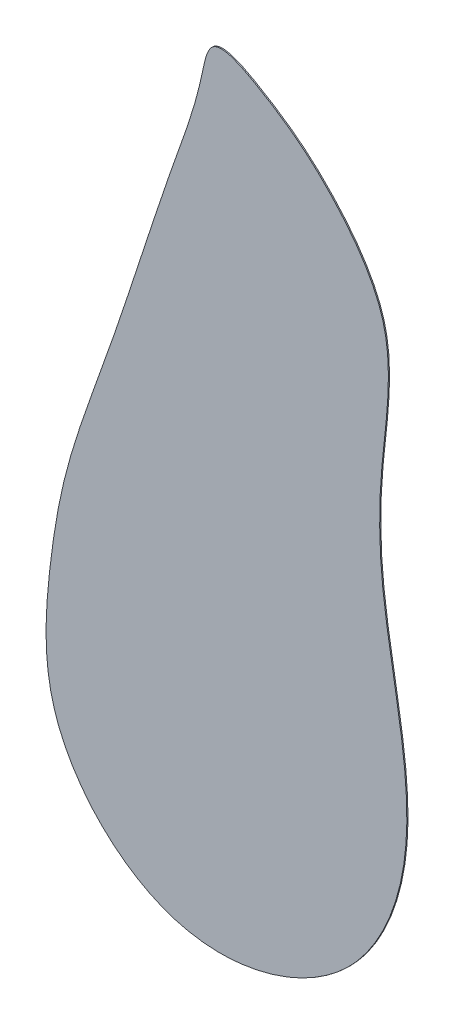
ISO-10303-21;
HEADER;
FILE_DESCRIPTION(('STEP AP214'),'2;1');
FILE_NAME('part.step','',(''),(''),'','','');
FILE_SCHEMA(('AUTOMOTIVE_DESIGN { 1 0 10303 214 1 1 1 1 }'));
ENDSEC;
DATA;
#1=APPLICATION_CONTEXT('core data for automotive mechanical design processes');
#2=APPLICATION_PROTOCOL_DEFINITION('international standard','automotive_design',2000,#1);
#3=PRODUCT_CONTEXT('',#1,'mechanical');
#4=PRODUCT('Part','Part','',(#3));
#5=PRODUCT_RELATED_PRODUCT_CATEGORY('part','',(#4));
#6=PRODUCT_DEFINITION_FORMATION('','',#4);
#7=PRODUCT_DEFINITION_CONTEXT('part definition',#1,'design');
#8=PRODUCT_DEFINITION('design','',#6,#7);
#9=PRODUCT_DEFINITION_SHAPE('','',#8);
#10=(LENGTH_UNIT() NAMED_UNIT(*) SI_UNIT(.MILLI.,.METRE.));
#11=(NAMED_UNIT(*) PLANE_ANGLE_UNIT() SI_UNIT($,.RADIAN.));
#12=(NAMED_UNIT(*) SI_UNIT($,.STERADIAN.) SOLID_ANGLE_UNIT());
#13=UNCERTAINTY_MEASURE_WITH_UNIT(LENGTH_MEASURE(1.E-05),#10,'distance_accuracy_value','');
#14=(GEOMETRIC_REPRESENTATION_CONTEXT(3) GLOBAL_UNCERTAINTY_ASSIGNED_CONTEXT((#13)) GLOBAL_UNIT_ASSIGNED_CONTEXT((#10,
#11,#12)) REPRESENTATION_CONTEXT('',''));
#15=CARTESIAN_POINT('',(0.,0.,0.));
#16=DIRECTION('',(0.,0.,1.));
#17=DIRECTION('',(1.,0.,0.));
#18=AXIS2_PLACEMENT_3D('',#15,#16,#17);
#19=CARTESIAN_POINT('',(391.93374839817,73.4595966769245,0.5));
#20=CARTESIAN_POINT('',(410.143996473131,75.6519660038807,0.5));
#21=CARTESIAN_POINT('',(446.513636093285,93.0640316556654,0.5));
#22=CARTESIAN_POINT('',(469.231718021987,149.594063298231,0.5));
#23=CARTESIAN_POINT('',(461.971844539764,204.234893939926,0.5));
#24=CARTESIAN_POINT('',(452.804543922023,251.444009302195,0.5));
#25=CARTESIAN_POINT('',(452.879284064672,293.095802350204,0.5));
#26=CARTESIAN_POINT('',(458.08302778236,324.715319246648,0.5));
#27=CARTESIAN_POINT('',(455.038328644619,359.534046432565,0.5));
#28=CARTESIAN_POINT('',(431.753334073771,389.836201905903,0.5));
#29=CARTESIAN_POINT('',(408.515877566773,408.564899739809,0.5));
#30=CARTESIAN_POINT('',(378.017146458981,424.563221849664,0.5));
#31=CARTESIAN_POINT('',(372.908340705503,394.806846170619,0.5));
#32=CARTESIAN_POINT('',(356.620781118573,351.854437007961,0.5));
#33=CARTESIAN_POINT('',(337.050301625761,287.273657201412,0.5));
#34=CARTESIAN_POINT('',(313.63561255409,226.691754566167,0.5));
#35=CARTESIAN_POINT('',(305.804854101828,176.82886254094,0.5));
#36=CARTESIAN_POINT('',(302.854619518429,119.339422242147,0.5));
#37=CARTESIAN_POINT('',(346.886712078799,74.7807298273148,0.5));
#38=CARTESIAN_POINT('',(381.813194860185,72.2411623614136,0.5));
#39=CARTESIAN_POINT('',(391.93374839817,73.4595966769245,0.5));
#40=B_SPLINE_CURVE_WITH_KNOTS('',3,(#19,#20,#21,#22,#23,#24,#25,#26,#27,#28,#29,#30,#31,#32,#33,
#34,#35,#36,#37,#38,#39),.UNSPECIFIED.,.T.,.F.,(4,1,1,1,1,1,1,1,1,1,1,1,1,1,1,1,1,1,4),(0.,
0.0658804237969696,0.134230613531824,0.205981343334024,0.264113723156657,0.309367338765981,
0.35665712649436,0.380395812451732,0.435061007338943,0.482771822356092,0.508157049249313,
0.524267343468281,0.572579831878026,0.69103225043629,0.760870462324055,0.809365133193175,
0.875017385321382,0.963386201363221,1.),.UNSPECIFIED.);
#41=DIRECTION('',(0.,0.,-1.));
#42=VECTOR('',#41,1.);
#43=SURFACE_OF_LINEAR_EXTRUSION('',#40,#42);
#44=CARTESIAN_POINT('',(391.93374839817,73.4595966769245,0.5));
#45=VERTEX_POINT('',#44);
#46=EDGE_CURVE('E10',#45,#45,#40,.T.);
#47=ORIENTED_EDGE('',*,*,#46,.F.);
#48=EDGE_LOOP('',(#47));
#49=FACE_BOUND('',#48,.T.);
#50=CARTESIAN_POINT('',(391.93374839817,73.4595966769245,0.));
#51=CARTESIAN_POINT('',(410.143996473131,75.6519660038807,0.));
#52=CARTESIAN_POINT('',(446.513636093285,93.0640316556654,0.));
#53=CARTESIAN_POINT('',(469.231718021987,149.594063298231,0.));
#54=CARTESIAN_POINT('',(461.971844539764,204.234893939926,0.));
#55=CARTESIAN_POINT('',(452.804543922023,251.444009302195,0.));
#56=CARTESIAN_POINT('',(452.879284064672,293.095802350204,0.));
#57=CARTESIAN_POINT('',(458.08302778236,324.715319246648,0.));
#58=CARTESIAN_POINT('',(455.038328644619,359.534046432565,0.));
#59=CARTESIAN_POINT('',(431.753334073771,389.836201905903,0.));
#60=CARTESIAN_POINT('',(408.515877566773,408.564899739809,0.));
#61=CARTESIAN_POINT('',(378.017146458981,424.563221849664,0.));
#62=CARTESIAN_POINT('',(372.908340705503,394.806846170619,0.));
#63=CARTESIAN_POINT('',(356.620781118573,351.854437007961,0.));
#64=CARTESIAN_POINT('',(337.050301625761,287.273657201412,0.));
#65=CARTESIAN_POINT('',(313.63561255409,226.691754566167,0.));
#66=CARTESIAN_POINT('',(305.804854101828,176.82886254094,0.));
#67=CARTESIAN_POINT('',(302.854619518429,119.339422242147,0.));
#68=CARTESIAN_POINT('',(346.886712078799,74.7807298273148,0.));
#69=CARTESIAN_POINT('',(381.813194860185,72.2411623614136,0.));
#70=CARTESIAN_POINT('',(391.93374839817,73.4595966769245,0.));
#71=B_SPLINE_CURVE_WITH_KNOTS('',3,(#50,#51,#52,#53,#54,#55,#56,#57,#58,#59,#60,#61,#62,#63,#64,
#65,#66,#67,#68,#69,#70),.UNSPECIFIED.,.T.,.F.,(4,1,1,1,1,1,1,1,1,1,1,1,1,1,1,1,1,1,4),(0.,
0.0658804237969696,0.134230613531824,0.205981343334024,0.264113723156657,0.309367338765981,
0.35665712649436,0.380395812451732,0.435061007338943,0.482771822356092,0.508157049249313,
0.524267343468281,0.572579831878026,0.69103225043629,0.760870462324055,0.809365133193175,
0.875017385321382,0.963386201363221,1.),.UNSPECIFIED.);
#72=CARTESIAN_POINT('',(391.93374839817,73.4595966769245,0.));
#73=VERTEX_POINT('',#72);
#74=EDGE_CURVE('E41',#73,#73,#71,.T.);
#75=ORIENTED_EDGE('',*,*,#74,.T.);
#76=EDGE_LOOP('',(#75));
#77=FACE_BOUND('',#76,.T.);
#78=ADVANCED_FACE('F37',(#49,#77),#43,.F.);
#79=CARTESIAN_POINT('',(384.549297813065,419.36848566656,0.5));
#80=DIRECTION('',(0.,0.,1.));
#81=DIRECTION('',(1.,0.,0.));
#82=AXIS2_PLACEMENT_3D('',#79,#80,#81);
#83=PLANE('',#82);
#84=ORIENTED_EDGE('',*,*,#46,.T.);
#85=EDGE_LOOP('',(#84));
#86=FACE_BOUND('',#85,.T.);
#87=ADVANCED_FACE('F60',(#86),#83,.T.);
#88=CARTESIAN_POINT('',(384.549297813065,419.36848566656,0.));
#89=DIRECTION('',(0.,0.,1.));
#90=DIRECTION('',(1.,0.,0.));
#91=AXIS2_PLACEMENT_3D('',#88,#89,#90);
#92=PLANE('',#91);
#93=ORIENTED_EDGE('',*,*,#74,.F.);
#94=EDGE_LOOP('',(#93));
#95=FACE_BOUND('',#94,.T.);
#96=ADVANCED_FACE('F58',(#95),#92,.F.);
#97=CLOSED_SHELL('',(#78,#87,#96));
#98=MANIFOLD_SOLID_BREP('B2',#97);
#99=ADVANCED_BREP_SHAPE_REPRESENTATION('',(#18,#98),#14);
#100=SHAPE_DEFINITION_REPRESENTATION(#9,#99);
ENDSEC;
END-ISO-10303-21;
